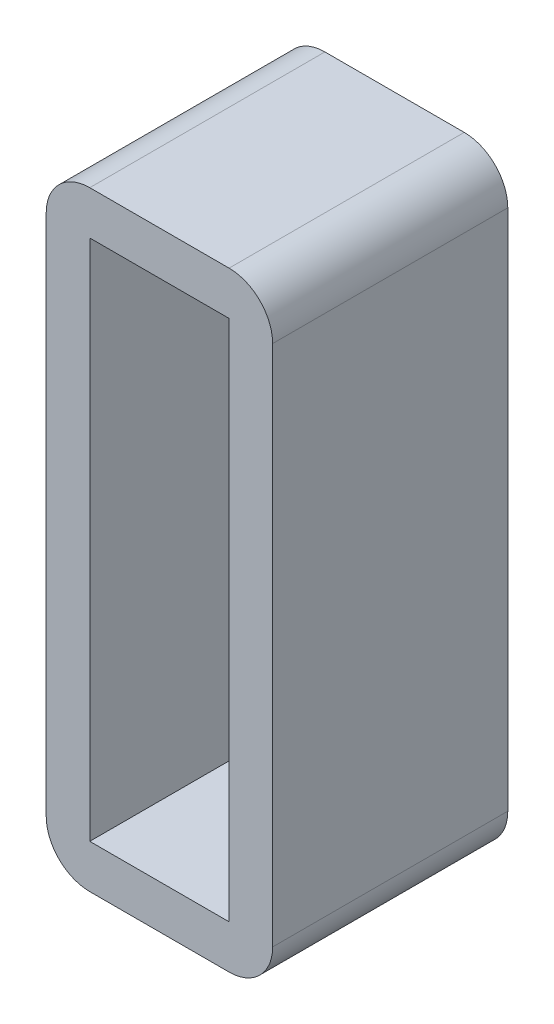
ISO-10303-21;
HEADER;
FILE_DESCRIPTION(('STEP AP214'),'2;1');
FILE_NAME('part.step','',(''),(''),'','','');
FILE_SCHEMA(('AUTOMOTIVE_DESIGN { 1 0 10303 214 1 1 1 1 }'));
ENDSEC;
DATA;
#1=APPLICATION_CONTEXT('core data for automotive mechanical design processes');
#2=APPLICATION_PROTOCOL_DEFINITION('international standard','automotive_design',2000,#1);
#3=PRODUCT_CONTEXT('',#1,'mechanical');
#4=PRODUCT('Part','Part','',(#3));
#5=PRODUCT_RELATED_PRODUCT_CATEGORY('part','',(#4));
#6=PRODUCT_DEFINITION_FORMATION('','',#4);
#7=PRODUCT_DEFINITION_CONTEXT('part definition',#1,'design');
#8=PRODUCT_DEFINITION('design','',#6,#7);
#9=PRODUCT_DEFINITION_SHAPE('','',#8);
#10=(LENGTH_UNIT() NAMED_UNIT(*) SI_UNIT(.MILLI.,.METRE.));
#11=(NAMED_UNIT(*) PLANE_ANGLE_UNIT() SI_UNIT($,.RADIAN.));
#12=(NAMED_UNIT(*) SI_UNIT($,.STERADIAN.) SOLID_ANGLE_UNIT());
#13=UNCERTAINTY_MEASURE_WITH_UNIT(LENGTH_MEASURE(1.E-05),#10,'distance_accuracy_value','');
#14=(GEOMETRIC_REPRESENTATION_CONTEXT(3) GLOBAL_UNCERTAINTY_ASSIGNED_CONTEXT((#13)) GLOBAL_UNIT_ASSIGNED_CONTEXT((#10,
#11,#12)) REPRESENTATION_CONTEXT('',''));
#15=CARTESIAN_POINT('',(0.,0.,0.));
#16=DIRECTION('',(0.,0.,1.));
#17=DIRECTION('',(1.,0.,0.));
#18=AXIS2_PLACEMENT_3D('',#15,#16,#17);
#19=CARTESIAN_POINT('',(-8.,30.,13.5));
#20=DIRECTION('',(0.,0.,1.));
#21=DIRECTION('',(1.,0.,0.));
#22=AXIS2_PLACEMENT_3D('',#19,#20,#21);
#23=PLANE('',#22);
#24=CARTESIAN_POINT('',(-8.,30.,13.5));
#25=DIRECTION('',(0.,0.,1.));
#26=DIRECTION('',(1.,0.,0.));
#27=AXIS2_PLACEMENT_3D('',#24,#25,#26);
#28=CIRCLE('',#27,5.);
#29=CARTESIAN_POINT('',(-8.,35.,13.5));
#30=VERTEX_POINT('',#29);
#31=CARTESIAN_POINT('',(-13.,30.,13.5));
#32=VERTEX_POINT('',#31);
#33=EDGE_CURVE('E177',#30,#32,#28,.T.);
#34=ORIENTED_EDGE('',*,*,#33,.T.);
#35=DIRECTION('',(0.,-1.,0.));
#36=VECTOR('',#35,1.);
#37=CARTESIAN_POINT('',(-13.,30.,13.5));
#38=LINE('',#37,#36);
#39=CARTESIAN_POINT('',(-13.,-30.,13.5));
#40=VERTEX_POINT('',#39);
#41=EDGE_CURVE('E181',#32,#40,#38,.T.);
#42=ORIENTED_EDGE('',*,*,#41,.T.);
#43=CARTESIAN_POINT('',(-8.,-30.,13.5));
#44=DIRECTION('',(0.,0.,1.));
#45=DIRECTION('',(1.,0.,0.));
#46=AXIS2_PLACEMENT_3D('',#43,#44,#45);
#47=CIRCLE('',#46,5.);
#48=CARTESIAN_POINT('',(-8.,-35.,13.5));
#49=VERTEX_POINT('',#48);
#50=EDGE_CURVE('E185',#40,#49,#47,.T.);
#51=ORIENTED_EDGE('',*,*,#50,.T.);
#52=DIRECTION('',(1.,0.,0.));
#53=VECTOR('',#52,1.);
#54=CARTESIAN_POINT('',(-8.,-35.,13.5));
#55=LINE('',#54,#53);
#56=CARTESIAN_POINT('',(8.,-35.,13.5));
#57=VERTEX_POINT('',#56);
#58=EDGE_CURVE('E188',#49,#57,#55,.T.);
#59=ORIENTED_EDGE('',*,*,#58,.T.);
#60=CARTESIAN_POINT('',(8.,-30.,13.5));
#61=DIRECTION('',(0.,0.,1.));
#62=DIRECTION('',(1.,0.,0.));
#63=AXIS2_PLACEMENT_3D('',#60,#61,#62);
#64=CIRCLE('',#63,5.);
#65=CARTESIAN_POINT('',(13.,-30.,13.5));
#66=VERTEX_POINT('',#65);
#67=EDGE_CURVE('E191',#57,#66,#64,.T.);
#68=ORIENTED_EDGE('',*,*,#67,.T.);
#69=DIRECTION('',(0.,1.,0.));
#70=VECTOR('',#69,1.);
#71=CARTESIAN_POINT('',(13.,30.,13.5));
#72=LINE('',#71,#70);
#73=CARTESIAN_POINT('',(13.,30.,13.5));
#74=VERTEX_POINT('',#73);
#75=EDGE_CURVE('E194',#66,#74,#72,.T.);
#76=ORIENTED_EDGE('',*,*,#75,.T.);
#77=CARTESIAN_POINT('',(7.99999999999999,30.,13.5));
#78=DIRECTION('',(0.,0.,1.));
#79=DIRECTION('',(-1.,0.,0.));
#80=AXIS2_PLACEMENT_3D('',#77,#78,#79);
#81=CIRCLE('',#80,5.);
#82=CARTESIAN_POINT('',(7.99999999999999,35.,13.5));
#83=VERTEX_POINT('',#82);
#84=EDGE_CURVE('E197',#74,#83,#81,.T.);
#85=ORIENTED_EDGE('',*,*,#84,.T.);
#86=DIRECTION('',(-1.,0.,0.));
#87=VECTOR('',#86,1.);
#88=CARTESIAN_POINT('',(-8.,35.,13.5));
#89=LINE('',#88,#87);
#90=EDGE_CURVE('E200',#83,#30,#89,.T.);
#91=ORIENTED_EDGE('',*,*,#90,.T.);
#92=EDGE_LOOP('',(#34,#42,#51,#59,#68,#76,#85,#91));
#93=FACE_BOUND('',#92,.T.);
#94=DIRECTION('',(-1.,0.,0.));
#95=VECTOR('',#94,1.);
#96=CARTESIAN_POINT('',(-8.00000000000001,30.,13.5));
#97=LINE('',#96,#95);
#98=CARTESIAN_POINT('',(7.99999999999999,30.,13.5));
#99=VERTEX_POINT('',#98);
#100=CARTESIAN_POINT('',(-8.00000000000001,30.,13.5));
#101=VERTEX_POINT('',#100);
#102=EDGE_CURVE('E138',#99,#101,#97,.T.);
#103=ORIENTED_EDGE('',*,*,#102,.F.);
#104=DIRECTION('',(0.,1.,0.));
#105=VECTOR('',#104,1.);
#106=CARTESIAN_POINT('',(7.99999999999999,30.,13.5));
#107=LINE('',#106,#105);
#108=CARTESIAN_POINT('',(8.,-30.,13.5));
#109=VERTEX_POINT('',#108);
#110=EDGE_CURVE('E129',#109,#99,#107,.T.);
#111=ORIENTED_EDGE('',*,*,#110,.F.);
#112=DIRECTION('',(1.,0.,0.));
#113=VECTOR('',#112,1.);
#114=CARTESIAN_POINT('',(-8.,-30.,13.5));
#115=LINE('',#114,#113);
#116=CARTESIAN_POINT('',(-8.,-30.,13.5));
#117=VERTEX_POINT('',#116);
#118=EDGE_CURVE('E155',#117,#109,#115,.T.);
#119=ORIENTED_EDGE('',*,*,#118,.F.);
#120=DIRECTION('',(0.,-1.,0.));
#121=VECTOR('',#120,1.);
#122=CARTESIAN_POINT('',(-8.00000000000001,30.,13.5));
#123=LINE('',#122,#121);
#124=EDGE_CURVE('E151',#101,#117,#123,.T.);
#125=ORIENTED_EDGE('',*,*,#124,.F.);
#126=EDGE_LOOP('',(#103,#111,#119,#125));
#127=FACE_BOUND('',#126,.T.);
#128=ADVANCED_FACE('F39',(#93,#127),#23,.T.);
#129=CARTESIAN_POINT('',(-8.,30.,-13.5));
#130=DIRECTION('',(0.,0.,1.));
#131=DIRECTION('',(1.,0.,0.));
#132=AXIS2_PLACEMENT_3D('',#129,#130,#131);
#133=PLANE('',#132);
#134=CARTESIAN_POINT('',(-8.,30.,-13.5));
#135=DIRECTION('',(0.,0.,1.));
#136=DIRECTION('',(1.,0.,0.));
#137=AXIS2_PLACEMENT_3D('',#134,#135,#136);
#138=CIRCLE('',#137,5.);
#139=CARTESIAN_POINT('',(-8.,35.,-13.5));
#140=VERTEX_POINT('',#139);
#141=CARTESIAN_POINT('',(-13.,30.,-13.5));
#142=VERTEX_POINT('',#141);
#143=EDGE_CURVE('E147',#140,#142,#138,.T.);
#144=ORIENTED_EDGE('',*,*,#143,.F.);
#145=DIRECTION('',(-1.,0.,0.));
#146=VECTOR('',#145,1.);
#147=CARTESIAN_POINT('',(-8.,35.,-13.5));
#148=LINE('',#147,#146);
#149=CARTESIAN_POINT('',(7.99999999999999,35.,-13.5));
#150=VERTEX_POINT('',#149);
#151=EDGE_CURVE('E182',#150,#140,#148,.T.);
#152=ORIENTED_EDGE('',*,*,#151,.F.);
#153=CARTESIAN_POINT('',(7.99999999999999,30.,-13.5));
#154=DIRECTION('',(0.,0.,1.));
#155=DIRECTION('',(-1.,0.,0.));
#156=AXIS2_PLACEMENT_3D('',#153,#154,#155);
#157=CIRCLE('',#156,5.);
#158=CARTESIAN_POINT('',(13.,30.,-13.5));
#159=VERTEX_POINT('',#158);
#160=EDGE_CURVE('E222',#159,#150,#157,.T.);
#161=ORIENTED_EDGE('',*,*,#160,.F.);
#162=DIRECTION('',(0.,1.,0.));
#163=VECTOR('',#162,1.);
#164=CARTESIAN_POINT('',(13.,30.,-13.5));
#165=LINE('',#164,#163);
#166=CARTESIAN_POINT('',(13.,-30.,-13.5));
#167=VERTEX_POINT('',#166);
#168=EDGE_CURVE('E219',#167,#159,#165,.T.);
#169=ORIENTED_EDGE('',*,*,#168,.F.);
#170=CARTESIAN_POINT('',(8.,-30.,-13.5));
#171=DIRECTION('',(0.,0.,1.));
#172=DIRECTION('',(1.,0.,0.));
#173=AXIS2_PLACEMENT_3D('',#170,#171,#172);
#174=CIRCLE('',#173,5.);
#175=CARTESIAN_POINT('',(8.,-35.,-13.5));
#176=VERTEX_POINT('',#175);
#177=EDGE_CURVE('E216',#176,#167,#174,.T.);
#178=ORIENTED_EDGE('',*,*,#177,.F.);
#179=DIRECTION('',(1.,0.,0.));
#180=VECTOR('',#179,1.);
#181=CARTESIAN_POINT('',(-8.,-35.,-13.5));
#182=LINE('',#181,#180);
#183=CARTESIAN_POINT('',(-8.,-35.,-13.5));
#184=VERTEX_POINT('',#183);
#185=EDGE_CURVE('E213',#184,#176,#182,.T.);
#186=ORIENTED_EDGE('',*,*,#185,.F.);
#187=CARTESIAN_POINT('',(-8.,-30.,-13.5));
#188=DIRECTION('',(0.,0.,1.));
#189=DIRECTION('',(1.,0.,0.));
#190=AXIS2_PLACEMENT_3D('',#187,#188,#189);
#191=CIRCLE('',#190,5.);
#192=CARTESIAN_POINT('',(-13.,-30.,-13.5));
#193=VERTEX_POINT('',#192);
#194=EDGE_CURVE('E210',#193,#184,#191,.T.);
#195=ORIENTED_EDGE('',*,*,#194,.F.);
#196=DIRECTION('',(0.,-1.,0.));
#197=VECTOR('',#196,1.);
#198=CARTESIAN_POINT('',(-13.,30.,-13.5));
#199=LINE('',#198,#197);
#200=EDGE_CURVE('E207',#142,#193,#199,.T.);
#201=ORIENTED_EDGE('',*,*,#200,.F.);
#202=EDGE_LOOP('',(#144,#152,#161,#169,#178,#186,#195,#201));
#203=FACE_BOUND('',#202,.T.);
#204=DIRECTION('',(0.,1.,0.));
#205=VECTOR('',#204,1.);
#206=CARTESIAN_POINT('',(7.99999999999999,30.,-13.5));
#207=LINE('',#206,#205);
#208=CARTESIAN_POINT('',(8.,-30.,-13.5));
#209=VERTEX_POINT('',#208);
#210=CARTESIAN_POINT('',(7.99999999999999,30.,-13.5));
#211=VERTEX_POINT('',#210);
#212=EDGE_CURVE('E63',#209,#211,#207,.T.);
#213=ORIENTED_EDGE('',*,*,#212,.T.);
#214=DIRECTION('',(-1.,0.,0.));
#215=VECTOR('',#214,1.);
#216=CARTESIAN_POINT('',(-8.00000000000001,30.,-13.5));
#217=LINE('',#216,#215);
#218=CARTESIAN_POINT('',(-8.00000000000001,30.,-13.5));
#219=VERTEX_POINT('',#218);
#220=EDGE_CURVE('E145',#211,#219,#217,.T.);
#221=ORIENTED_EDGE('',*,*,#220,.T.);
#222=DIRECTION('',(0.,-1.,0.));
#223=VECTOR('',#222,1.);
#224=CARTESIAN_POINT('',(-8.00000000000001,30.,-13.5));
#225=LINE('',#224,#223);
#226=CARTESIAN_POINT('',(-8.,-30.,-13.5));
#227=VERTEX_POINT('',#226);
#228=EDGE_CURVE('E164',#219,#227,#225,.T.);
#229=ORIENTED_EDGE('',*,*,#228,.T.);
#230=DIRECTION('',(1.,0.,0.));
#231=VECTOR('',#230,1.);
#232=CARTESIAN_POINT('',(-8.,-30.,-13.5));
#233=LINE('',#232,#231);
#234=EDGE_CURVE('E139',#227,#209,#233,.T.);
#235=ORIENTED_EDGE('',*,*,#234,.T.);
#236=EDGE_LOOP('',(#213,#221,#229,#235));
#237=FACE_BOUND('',#236,.T.);
#238=ADVANCED_FACE('F261',(#203,#237),#133,.F.);
#239=CARTESIAN_POINT('',(-8.,30.,13.5));
#240=DIRECTION('',(0.,0.,-1.));
#241=DIRECTION('',(-1.,0.,0.));
#242=AXIS2_PLACEMENT_3D('',#239,#240,#241);
#243=CYLINDRICAL_SURFACE('',#242,5.);
#244=ORIENTED_EDGE('',*,*,#143,.T.);
#245=DIRECTION('',(0.,0.,-1.));
#246=VECTOR('',#245,1.);
#247=CARTESIAN_POINT('',(-13.,30.,13.5));
#248=LINE('',#247,#246);
#249=EDGE_CURVE('E11',#32,#142,#248,.T.);
#250=ORIENTED_EDGE('',*,*,#249,.F.);
#251=ORIENTED_EDGE('',*,*,#33,.F.);
#252=DIRECTION('',(0.,0.,-1.));
#253=VECTOR('',#252,1.);
#254=CARTESIAN_POINT('',(-8.,35.,13.5));
#255=LINE('',#254,#253);
#256=EDGE_CURVE('E203',#30,#140,#255,.T.);
#257=ORIENTED_EDGE('',*,*,#256,.T.);
#258=EDGE_LOOP('',(#244,#250,#251,#257));
#259=FACE_BOUND('',#258,.T.);
#260=ADVANCED_FACE('F41',(#259),#243,.T.);
#261=CARTESIAN_POINT('',(-13.,30.,13.5));
#262=DIRECTION('',(1.,0.,0.));
#263=DIRECTION('',(0.,1.,0.));
#264=AXIS2_PLACEMENT_3D('',#261,#262,#263);
#265=PLANE('',#264);
#266=ORIENTED_EDGE('',*,*,#200,.T.);
#267=DIRECTION('',(0.,0.,-1.));
#268=VECTOR('',#267,1.);
#269=CARTESIAN_POINT('',(-13.,-30.,13.5));
#270=LINE('',#269,#268);
#271=EDGE_CURVE('E48',#40,#193,#270,.T.);
#272=ORIENTED_EDGE('',*,*,#271,.F.);
#273=ORIENTED_EDGE('',*,*,#41,.F.);
#274=ORIENTED_EDGE('',*,*,#249,.T.);
#275=EDGE_LOOP('',(#266,#272,#273,#274));
#276=FACE_BOUND('',#275,.T.);
#277=ADVANCED_FACE('F278',(#276),#265,.F.);
#278=CARTESIAN_POINT('',(-8.,-30.,13.5));
#279=DIRECTION('',(0.,0.,-1.));
#280=DIRECTION('',(-1.,0.,0.));
#281=AXIS2_PLACEMENT_3D('',#278,#279,#280);
#282=CYLINDRICAL_SURFACE('',#281,5.);
#283=ORIENTED_EDGE('',*,*,#194,.T.);
#284=DIRECTION('',(0.,0.,-1.));
#285=VECTOR('',#284,1.);
#286=CARTESIAN_POINT('',(-8.,-35.,13.5));
#287=LINE('',#286,#285);
#288=EDGE_CURVE('E246',#49,#184,#287,.T.);
#289=ORIENTED_EDGE('',*,*,#288,.F.);
#290=ORIENTED_EDGE('',*,*,#50,.F.);
#291=ORIENTED_EDGE('',*,*,#271,.T.);
#292=EDGE_LOOP('',(#283,#289,#290,#291));
#293=FACE_BOUND('',#292,.T.);
#294=ADVANCED_FACE('F255',(#293),#282,.T.);
#295=CARTESIAN_POINT('',(-8.,-35.,13.5));
#296=DIRECTION('',(0.,1.,0.));
#297=DIRECTION('',(0.,0.,1.));
#298=AXIS2_PLACEMENT_3D('',#295,#296,#297);
#299=PLANE('',#298);
#300=ORIENTED_EDGE('',*,*,#185,.T.);
#301=DIRECTION('',(0.,0.,-1.));
#302=VECTOR('',#301,1.);
#303=CARTESIAN_POINT('',(8.,-35.,13.5));
#304=LINE('',#303,#302);
#305=EDGE_CURVE('E242',#57,#176,#304,.T.);
#306=ORIENTED_EDGE('',*,*,#305,.F.);
#307=ORIENTED_EDGE('',*,*,#58,.F.);
#308=ORIENTED_EDGE('',*,*,#288,.T.);
#309=EDGE_LOOP('',(#300,#306,#307,#308));
#310=FACE_BOUND('',#309,.T.);
#311=ADVANCED_FACE('F267',(#310),#299,.F.);
#312=CARTESIAN_POINT('',(8.,-30.,13.5));
#313=DIRECTION('',(0.,0.,-1.));
#314=DIRECTION('',(-1.,0.,0.));
#315=AXIS2_PLACEMENT_3D('',#312,#313,#314);
#316=CYLINDRICAL_SURFACE('',#315,5.);
#317=ORIENTED_EDGE('',*,*,#177,.T.);
#318=DIRECTION('',(0.,0.,-1.));
#319=VECTOR('',#318,1.);
#320=CARTESIAN_POINT('',(13.,-30.,13.5));
#321=LINE('',#320,#319);
#322=EDGE_CURVE('E238',#66,#167,#321,.T.);
#323=ORIENTED_EDGE('',*,*,#322,.F.);
#324=ORIENTED_EDGE('',*,*,#67,.F.);
#325=ORIENTED_EDGE('',*,*,#305,.T.);
#326=EDGE_LOOP('',(#317,#323,#324,#325));
#327=FACE_BOUND('',#326,.T.);
#328=ADVANCED_FACE('F271',(#327),#316,.T.);
#329=CARTESIAN_POINT('',(13.,30.,13.5));
#330=DIRECTION('',(-1.,0.,0.));
#331=DIRECTION('',(0.,-1.,0.));
#332=AXIS2_PLACEMENT_3D('',#329,#330,#331);
#333=PLANE('',#332);
#334=ORIENTED_EDGE('',*,*,#168,.T.);
#335=DIRECTION('',(0.,0.,-1.));
#336=VECTOR('',#335,1.);
#337=CARTESIAN_POINT('',(13.,30.,13.5));
#338=LINE('',#337,#336);
#339=EDGE_CURVE('E234',#74,#159,#338,.T.);
#340=ORIENTED_EDGE('',*,*,#339,.F.);
#341=ORIENTED_EDGE('',*,*,#75,.F.);
#342=ORIENTED_EDGE('',*,*,#322,.T.);
#343=EDGE_LOOP('',(#334,#340,#341,#342));
#344=FACE_BOUND('',#343,.T.);
#345=ADVANCED_FACE('F291',(#344),#333,.F.);
#346=CARTESIAN_POINT('',(7.99999999999999,30.,13.5));
#347=DIRECTION('',(0.,0.,-1.));
#348=DIRECTION('',(-1.,0.,0.));
#349=AXIS2_PLACEMENT_3D('',#346,#347,#348);
#350=CYLINDRICAL_SURFACE('',#349,5.);
#351=ORIENTED_EDGE('',*,*,#160,.T.);
#352=DIRECTION('',(0.,0.,-1.));
#353=VECTOR('',#352,1.);
#354=CARTESIAN_POINT('',(7.99999999999999,35.,13.5));
#355=LINE('',#354,#353);
#356=EDGE_CURVE('E230',#83,#150,#355,.T.);
#357=ORIENTED_EDGE('',*,*,#356,.F.);
#358=ORIENTED_EDGE('',*,*,#84,.F.);
#359=ORIENTED_EDGE('',*,*,#339,.T.);
#360=EDGE_LOOP('',(#351,#357,#358,#359));
#361=FACE_BOUND('',#360,.T.);
#362=ADVANCED_FACE('F289',(#361),#350,.T.);
#363=CARTESIAN_POINT('',(-8.,35.,13.5));
#364=DIRECTION('',(0.,-1.,0.));
#365=DIRECTION('',(0.,0.,-1.));
#366=AXIS2_PLACEMENT_3D('',#363,#364,#365);
#367=PLANE('',#366);
#368=ORIENTED_EDGE('',*,*,#151,.T.);
#369=ORIENTED_EDGE('',*,*,#256,.F.);
#370=ORIENTED_EDGE('',*,*,#90,.F.);
#371=ORIENTED_EDGE('',*,*,#356,.T.);
#372=EDGE_LOOP('',(#368,#369,#370,#371));
#373=FACE_BOUND('',#372,.T.);
#374=ADVANCED_FACE('F284',(#373),#367,.F.);
#375=CARTESIAN_POINT('',(7.99999999999999,30.,13.5));
#376=DIRECTION('',(-1.,0.,0.));
#377=DIRECTION('',(0.,-1.,0.));
#378=AXIS2_PLACEMENT_3D('',#375,#376,#377);
#379=PLANE('',#378);
#380=ORIENTED_EDGE('',*,*,#212,.F.);
#381=DIRECTION('',(0.,0.,-1.));
#382=VECTOR('',#381,1.);
#383=CARTESIAN_POINT('',(8.,-30.,13.5));
#384=LINE('',#383,#382);
#385=EDGE_CURVE('E133',#109,#209,#384,.T.);
#386=ORIENTED_EDGE('',*,*,#385,.F.);
#387=ORIENTED_EDGE('',*,*,#110,.T.);
#388=DIRECTION('',(0.,0.,-1.));
#389=VECTOR('',#388,1.);
#390=CARTESIAN_POINT('',(7.99999999999999,30.,13.5));
#391=LINE('',#390,#389);
#392=EDGE_CURVE('E132',#99,#211,#391,.T.);
#393=ORIENTED_EDGE('',*,*,#392,.T.);
#394=EDGE_LOOP('',(#380,#386,#387,#393));
#395=FACE_BOUND('',#394,.T.);
#396=ADVANCED_FACE('F131',(#395),#379,.T.);
#397=CARTESIAN_POINT('',(-8.00000000000001,30.,13.5));
#398=DIRECTION('',(0.,-1.,0.));
#399=DIRECTION('',(0.,0.,-1.));
#400=AXIS2_PLACEMENT_3D('',#397,#398,#399);
#401=PLANE('',#400);
#402=ORIENTED_EDGE('',*,*,#220,.F.);
#403=ORIENTED_EDGE('',*,*,#392,.F.);
#404=ORIENTED_EDGE('',*,*,#102,.T.);
#405=DIRECTION('',(0.,0.,-1.));
#406=VECTOR('',#405,1.);
#407=CARTESIAN_POINT('',(-8.00000000000001,30.,13.5));
#408=LINE('',#407,#406);
#409=EDGE_CURVE('E148',#101,#219,#408,.T.);
#410=ORIENTED_EDGE('',*,*,#409,.T.);
#411=EDGE_LOOP('',(#402,#403,#404,#410));
#412=FACE_BOUND('',#411,.T.);
#413=ADVANCED_FACE('F142',(#412),#401,.T.);
#414=CARTESIAN_POINT('',(-8.00000000000001,30.,13.5));
#415=DIRECTION('',(1.,0.,0.));
#416=DIRECTION('',(0.,1.,0.));
#417=AXIS2_PLACEMENT_3D('',#414,#415,#416);
#418=PLANE('',#417);
#419=ORIENTED_EDGE('',*,*,#228,.F.);
#420=ORIENTED_EDGE('',*,*,#409,.F.);
#421=ORIENTED_EDGE('',*,*,#124,.T.);
#422=DIRECTION('',(0.,0.,-1.));
#423=VECTOR('',#422,1.);
#424=CARTESIAN_POINT('',(-8.,-30.,13.5));
#425=LINE('',#424,#423);
#426=EDGE_CURVE('E55',#117,#227,#425,.T.);
#427=ORIENTED_EDGE('',*,*,#426,.T.);
#428=EDGE_LOOP('',(#419,#420,#421,#427));
#429=FACE_BOUND('',#428,.T.);
#430=ADVANCED_FACE('F316',(#429),#418,.T.);
#431=CARTESIAN_POINT('',(-8.,-30.,13.5));
#432=DIRECTION('',(0.,1.,0.));
#433=DIRECTION('',(0.,0.,1.));
#434=AXIS2_PLACEMENT_3D('',#431,#432,#433);
#435=PLANE('',#434);
#436=ORIENTED_EDGE('',*,*,#234,.F.);
#437=ORIENTED_EDGE('',*,*,#426,.F.);
#438=ORIENTED_EDGE('',*,*,#118,.T.);
#439=ORIENTED_EDGE('',*,*,#385,.T.);
#440=EDGE_LOOP('',(#436,#437,#438,#439));
#441=FACE_BOUND('',#440,.T.);
#442=ADVANCED_FACE('F320',(#441),#435,.T.);
#443=CLOSED_SHELL('',(#128,#238,#260,#277,#294,#311,#328,#345,#362,#374,#396,#413,#430,#442));
#444=MANIFOLD_SOLID_BREP('B2',#443);
#445=ADVANCED_BREP_SHAPE_REPRESENTATION('',(#18,#444),#14);
#446=SHAPE_DEFINITION_REPRESENTATION(#9,#445);
ENDSEC;
END-ISO-10303-21;
